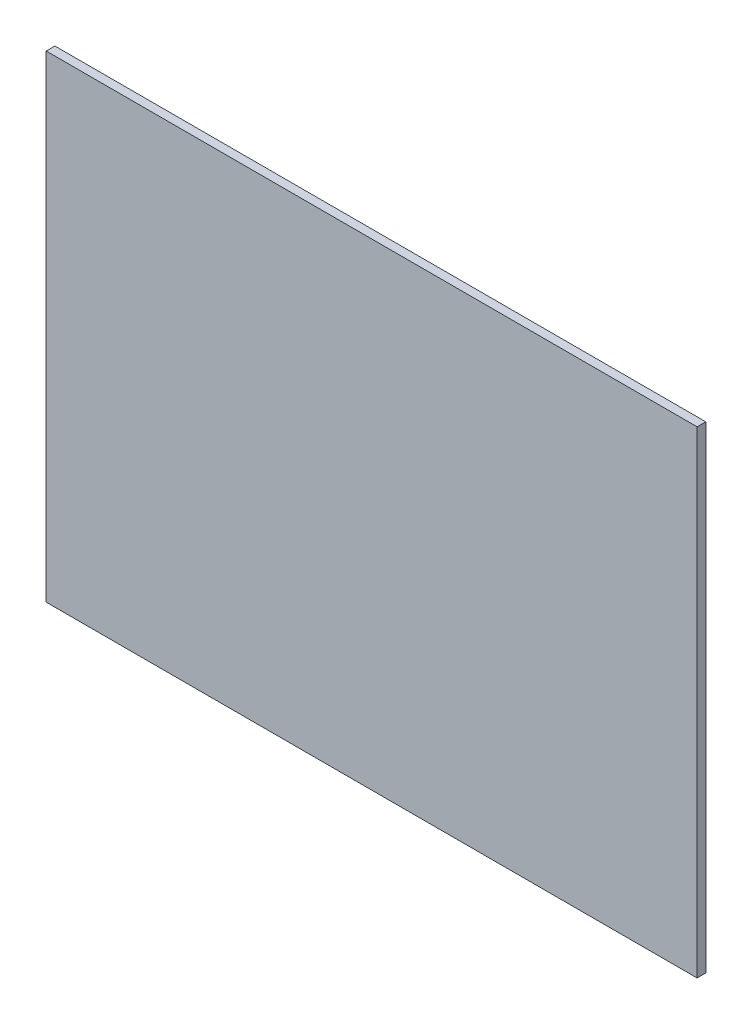
ISO-10303-21;
HEADER;
FILE_DESCRIPTION(('STEP AP214'),'2;1');
FILE_NAME('part.step','',(''),(''),'','','');
FILE_SCHEMA(('AUTOMOTIVE_DESIGN { 1 0 10303 214 1 1 1 1 }'));
ENDSEC;
DATA;
#1=APPLICATION_CONTEXT('core data for automotive mechanical design processes');
#2=APPLICATION_PROTOCOL_DEFINITION('international standard','automotive_design',2000,#1);
#3=PRODUCT_CONTEXT('',#1,'mechanical');
#4=PRODUCT('Part','Part','',(#3));
#5=PRODUCT_RELATED_PRODUCT_CATEGORY('part','',(#4));
#6=PRODUCT_DEFINITION_FORMATION('','',#4);
#7=PRODUCT_DEFINITION_CONTEXT('part definition',#1,'design');
#8=PRODUCT_DEFINITION('design','',#6,#7);
#9=PRODUCT_DEFINITION_SHAPE('','',#8);
#10=(LENGTH_UNIT() NAMED_UNIT(*) SI_UNIT(.MILLI.,.METRE.));
#11=(NAMED_UNIT(*) PLANE_ANGLE_UNIT() SI_UNIT($,.RADIAN.));
#12=(NAMED_UNIT(*) SI_UNIT($,.STERADIAN.) SOLID_ANGLE_UNIT());
#13=UNCERTAINTY_MEASURE_WITH_UNIT(LENGTH_MEASURE(1.E-05),#10,'distance_accuracy_value','');
#14=(GEOMETRIC_REPRESENTATION_CONTEXT(3) GLOBAL_UNCERTAINTY_ASSIGNED_CONTEXT((#13)) GLOBAL_UNIT_ASSIGNED_CONTEXT((#10,
#11,#12)) REPRESENTATION_CONTEXT('',''));
#15=CARTESIAN_POINT('',(0.,0.,0.));
#16=DIRECTION('',(0.,0.,1.));
#17=DIRECTION('',(1.,0.,0.));
#18=AXIS2_PLACEMENT_3D('',#15,#16,#17);
#19=CARTESIAN_POINT('',(0.,0.,4.));
#20=DIRECTION('',(1.,0.,0.));
#21=DIRECTION('',(0.,0.,-1.));
#22=AXIS2_PLACEMENT_3D('',#19,#20,#21);
#23=PLANE('',#22);
#24=DIRECTION('',(0.,-1.,0.));
#25=VECTOR('',#24,1.);
#26=CARTESIAN_POINT('',(0.,0.,0.));
#27=LINE('',#26,#25);
#28=CARTESIAN_POINT('',(0.,220.,0.));
#29=VERTEX_POINT('',#28);
#30=CARTESIAN_POINT('',(0.,0.,0.));
#31=VERTEX_POINT('',#30);
#32=EDGE_CURVE('E113',#29,#31,#27,.T.);
#33=ORIENTED_EDGE('',*,*,#32,.T.);
#34=DIRECTION('',(0.,0.,-1.));
#35=VECTOR('',#34,1.);
#36=CARTESIAN_POINT('',(0.,0.,4.));
#37=LINE('',#36,#35);
#38=CARTESIAN_POINT('',(0.,0.,4.));
#39=VERTEX_POINT('',#38);
#40=EDGE_CURVE('E11',#39,#31,#37,.T.);
#41=ORIENTED_EDGE('',*,*,#40,.F.);
#42=DIRECTION('',(0.,-1.,0.));
#43=VECTOR('',#42,1.);
#44=CARTESIAN_POINT('',(0.,0.,4.));
#45=LINE('',#44,#43);
#46=CARTESIAN_POINT('',(0.,220.,4.));
#47=VERTEX_POINT('',#46);
#48=EDGE_CURVE('E97',#47,#39,#45,.T.);
#49=ORIENTED_EDGE('',*,*,#48,.F.);
#50=DIRECTION('',(0.,0.,-1.));
#51=VECTOR('',#50,1.);
#52=CARTESIAN_POINT('',(0.,220.,4.));
#53=LINE('',#52,#51);
#54=EDGE_CURVE('E109',#47,#29,#53,.T.);
#55=ORIENTED_EDGE('',*,*,#54,.T.);
#56=EDGE_LOOP('',(#33,#41,#49,#55));
#57=FACE_BOUND('',#56,.T.);
#58=ADVANCED_FACE('F45',(#57),#23,.F.);
#59=CARTESIAN_POINT('',(0.,0.,4.));
#60=DIRECTION('',(0.,1.,0.));
#61=DIRECTION('',(0.,0.,1.));
#62=AXIS2_PLACEMENT_3D('',#59,#60,#61);
#63=PLANE('',#62);
#64=DIRECTION('',(1.,0.,0.));
#65=VECTOR('',#64,1.);
#66=CARTESIAN_POINT('',(0.,0.,0.));
#67=LINE('',#66,#65);
#68=CARTESIAN_POINT('',(300.,0.,0.));
#69=VERTEX_POINT('',#68);
#70=EDGE_CURVE('E102',#31,#69,#67,.T.);
#71=ORIENTED_EDGE('',*,*,#70,.T.);
#72=DIRECTION('',(0.,0.,-1.));
#73=VECTOR('',#72,1.);
#74=CARTESIAN_POINT('',(300.,0.,4.));
#75=LINE('',#74,#73);
#76=CARTESIAN_POINT('',(300.,0.,4.));
#77=VERTEX_POINT('',#76);
#78=EDGE_CURVE('E54',#77,#69,#75,.T.);
#79=ORIENTED_EDGE('',*,*,#78,.F.);
#80=DIRECTION('',(1.,0.,0.));
#81=VECTOR('',#80,1.);
#82=CARTESIAN_POINT('',(0.,0.,4.));
#83=LINE('',#82,#81);
#84=EDGE_CURVE('E92',#39,#77,#83,.T.);
#85=ORIENTED_EDGE('',*,*,#84,.F.);
#86=ORIENTED_EDGE('',*,*,#40,.T.);
#87=EDGE_LOOP('',(#71,#79,#85,#86));
#88=FACE_BOUND('',#87,.T.);
#89=ADVANCED_FACE('F101',(#88),#63,.F.);
#90=CARTESIAN_POINT('',(300.,0.,4.));
#91=DIRECTION('',(-1.,0.,0.));
#92=DIRECTION('',(0.,-1.,0.));
#93=AXIS2_PLACEMENT_3D('',#90,#91,#92);
#94=PLANE('',#93);
#95=DIRECTION('',(0.,1.,0.));
#96=VECTOR('',#95,1.);
#97=CARTESIAN_POINT('',(300.,0.,0.));
#98=LINE('',#97,#96);
#99=CARTESIAN_POINT('',(300.,220.,0.));
#100=VERTEX_POINT('',#99);
#101=EDGE_CURVE('E79',#69,#100,#98,.T.);
#102=ORIENTED_EDGE('',*,*,#101,.T.);
#103=DIRECTION('',(0.,0.,-1.));
#104=VECTOR('',#103,1.);
#105=CARTESIAN_POINT('',(300.,220.,4.));
#106=LINE('',#105,#104);
#107=CARTESIAN_POINT('',(300.,220.,4.));
#108=VERTEX_POINT('',#107);
#109=EDGE_CURVE('E104',#108,#100,#106,.T.);
#110=ORIENTED_EDGE('',*,*,#109,.F.);
#111=DIRECTION('',(0.,1.,0.));
#112=VECTOR('',#111,1.);
#113=CARTESIAN_POINT('',(300.,0.,4.));
#114=LINE('',#113,#112);
#115=EDGE_CURVE('E95',#77,#108,#114,.T.);
#116=ORIENTED_EDGE('',*,*,#115,.F.);
#117=ORIENTED_EDGE('',*,*,#78,.T.);
#118=EDGE_LOOP('',(#102,#110,#116,#117));
#119=FACE_BOUND('',#118,.T.);
#120=ADVANCED_FACE('F105',(#119),#94,.F.);
#121=CARTESIAN_POINT('',(0.,220.,4.));
#122=DIRECTION('',(0.,-1.,0.));
#123=DIRECTION('',(0.,0.,-1.));
#124=AXIS2_PLACEMENT_3D('',#121,#122,#123);
#125=PLANE('',#124);
#126=DIRECTION('',(-1.,0.,0.));
#127=VECTOR('',#126,1.);
#128=CARTESIAN_POINT('',(0.,220.,0.));
#129=LINE('',#128,#127);
#130=EDGE_CURVE('E85',#100,#29,#129,.T.);
#131=ORIENTED_EDGE('',*,*,#130,.T.);
#132=ORIENTED_EDGE('',*,*,#54,.F.);
#133=DIRECTION('',(-1.,0.,0.));
#134=VECTOR('',#133,1.);
#135=CARTESIAN_POINT('',(0.,220.,4.));
#136=LINE('',#135,#134);
#137=EDGE_CURVE('E62',#108,#47,#136,.T.);
#138=ORIENTED_EDGE('',*,*,#137,.F.);
#139=ORIENTED_EDGE('',*,*,#109,.T.);
#140=EDGE_LOOP('',(#131,#132,#138,#139));
#141=FACE_BOUND('',#140,.T.);
#142=ADVANCED_FACE('F126',(#141),#125,.F.);
#143=CARTESIAN_POINT('',(0.,0.,4.));
#144=DIRECTION('',(0.,0.,-1.));
#145=DIRECTION('',(-1.,0.,0.));
#146=AXIS2_PLACEMENT_3D('',#143,#144,#145);
#147=PLANE('',#146);
#148=ORIENTED_EDGE('',*,*,#48,.T.);
#149=ORIENTED_EDGE('',*,*,#84,.T.);
#150=ORIENTED_EDGE('',*,*,#115,.T.);
#151=ORIENTED_EDGE('',*,*,#137,.T.);
#152=EDGE_LOOP('',(#148,#149,#150,#151));
#153=FACE_BOUND('',#152,.T.);
#154=ADVANCED_FACE('F93',(#153),#147,.F.);
#155=CARTESIAN_POINT('',(0.,0.,0.));
#156=DIRECTION('',(0.,0.,-1.));
#157=DIRECTION('',(-1.,0.,0.));
#158=AXIS2_PLACEMENT_3D('',#155,#156,#157);
#159=PLANE('',#158);
#160=ORIENTED_EDGE('',*,*,#32,.F.);
#161=ORIENTED_EDGE('',*,*,#130,.F.);
#162=ORIENTED_EDGE('',*,*,#101,.F.);
#163=ORIENTED_EDGE('',*,*,#70,.F.);
#164=EDGE_LOOP('',(#160,#161,#162,#163));
#165=FACE_BOUND('',#164,.T.);
#166=ADVANCED_FACE('F129',(#165),#159,.T.);
#167=CLOSED_SHELL('',(#58,#89,#120,#142,#154,#166));
#168=MANIFOLD_SOLID_BREP('B2',#167);
#169=ADVANCED_BREP_SHAPE_REPRESENTATION('',(#18,#168),#14);
#170=SHAPE_DEFINITION_REPRESENTATION(#9,#169);
ENDSEC;
END-ISO-10303-21;
